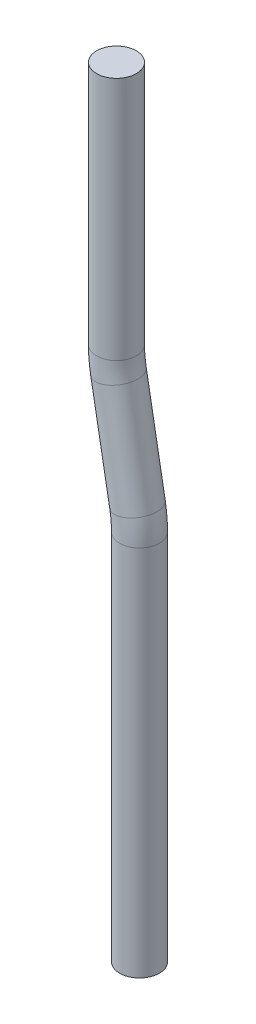
ISO-10303-21;
HEADER;
FILE_DESCRIPTION(('STEP AP214'),'2;1');
FILE_NAME('part.step','',(''),(''),'','','');
FILE_SCHEMA(('AUTOMOTIVE_DESIGN { 1 0 10303 214 1 1 1 1 }'));
ENDSEC;
DATA;
#1=APPLICATION_CONTEXT('core data for automotive mechanical design processes');
#2=APPLICATION_PROTOCOL_DEFINITION('international standard','automotive_design',2000,#1);
#3=PRODUCT_CONTEXT('',#1,'mechanical');
#4=PRODUCT('Part','Part','',(#3));
#5=PRODUCT_RELATED_PRODUCT_CATEGORY('part','',(#4));
#6=PRODUCT_DEFINITION_FORMATION('','',#4);
#7=PRODUCT_DEFINITION_CONTEXT('part definition',#1,'design');
#8=PRODUCT_DEFINITION('design','',#6,#7);
#9=PRODUCT_DEFINITION_SHAPE('','',#8);
#10=(LENGTH_UNIT() NAMED_UNIT(*) SI_UNIT(.MILLI.,.METRE.));
#11=(NAMED_UNIT(*) PLANE_ANGLE_UNIT() SI_UNIT($,.RADIAN.));
#12=(NAMED_UNIT(*) SI_UNIT($,.STERADIAN.) SOLID_ANGLE_UNIT());
#13=UNCERTAINTY_MEASURE_WITH_UNIT(LENGTH_MEASURE(1.E-05),#10,'distance_accuracy_value','');
#14=(GEOMETRIC_REPRESENTATION_CONTEXT(3) GLOBAL_UNCERTAINTY_ASSIGNED_CONTEXT((#13)) GLOBAL_UNIT_ASSIGNED_CONTEXT((#10,
#11,#12)) REPRESENTATION_CONTEXT('',''));
#15=CARTESIAN_POINT('',(0.,0.,0.));
#16=DIRECTION('',(0.,0.,1.));
#17=DIRECTION('',(1.,0.,0.));
#18=AXIS2_PLACEMENT_3D('',#15,#16,#17);
#19=CARTESIAN_POINT('',(0.,0.,0.));
#20=DIRECTION('',(0.,1.,0.));
#21=DIRECTION('',(0.,0.,1.));
#22=AXIS2_PLACEMENT_3D('',#19,#20,#21);
#23=PLANE('',#22);
#24=CARTESIAN_POINT('',(0.,0.,0.));
#25=DIRECTION('',(0.,1.,0.));
#26=DIRECTION('',(0.,0.,1.));
#27=AXIS2_PLACEMENT_3D('',#24,#25,#26);
#28=CIRCLE('',#27,3.937);
#29=CARTESIAN_POINT('',(0.,0.,3.937));
#30=VERTEX_POINT('',#29);
#31=EDGE_CURVE('E64',#30,#30,#28,.T.);
#32=ORIENTED_EDGE('',*,*,#31,.T.);
#33=EDGE_LOOP('',(#32));
#34=FACE_BOUND('',#33,.T.);
#35=ADVANCED_FACE('F37',(#34),#23,.T.);
#36=CARTESIAN_POINT('',(4.57200000000002,-152.4,0.));
#37=DIRECTION('',(0.,1.,0.));
#38=DIRECTION('',(0.,0.,1.));
#39=AXIS2_PLACEMENT_3D('',#36,#37,#38);
#40=PLANE('',#39);
#41=CARTESIAN_POINT('',(4.57200000000002,-152.4,0.));
#42=DIRECTION('',(0.,1.,0.));
#43=DIRECTION('',(0.,0.,1.));
#44=AXIS2_PLACEMENT_3D('',#41,#42,#43);
#45=CIRCLE('',#44,3.937);
#46=CARTESIAN_POINT('',(4.57200000000002,-152.4,3.937));
#47=VERTEX_POINT('',#46);
#48=EDGE_CURVE('E10',#47,#47,#45,.T.);
#49=ORIENTED_EDGE('',*,*,#48,.F.);
#50=EDGE_LOOP('',(#49));
#51=FACE_BOUND('',#50,.T.);
#52=ADVANCED_FACE('F73',(#51),#40,.F.);
#53=CARTESIAN_POINT('',(0.,0.,0.));
#54=DIRECTION('',(0.,-1.,0.));
#55=DIRECTION('',(1.,0.,0.));
#56=AXIS2_PLACEMENT_3D('',#53,#54,#55);
#57=CYLINDRICAL_SURFACE('',#56,3.937);
#58=CARTESIAN_POINT('',(0.,-48.5322225709485,0.));
#59=DIRECTION('',(0.,1.,0.));
#60=DIRECTION('',(0.,0.,1.));
#61=AXIS2_PLACEMENT_3D('',#58,#59,#60);
#62=CIRCLE('',#61,3.937);
#63=CARTESIAN_POINT('',(-3.937,-48.5322225709485,0.));
#64=VERTEX_POINT('',#63);
#65=EDGE_CURVE('E60',#64,#64,#62,.T.);
#66=ORIENTED_EDGE('',*,*,#65,.T.);
#67=EDGE_LOOP('',(#66));
#68=FACE_BOUND('',#67,.T.);
#69=ORIENTED_EDGE('',*,*,#31,.F.);
#70=EDGE_LOOP('',(#69));
#71=FACE_BOUND('',#70,.T.);
#72=ADVANCED_FACE('F70',(#68,#71),#57,.T.);
#73=CARTESIAN_POINT('',(25.4,-48.5322225709486,0.));
#74=DIRECTION('',(0.,0.,1.));
#75=DIRECTION('',(1.,0.,0.));
#76=AXIS2_PLACEMENT_3D('',#73,#74,#75);
#77=TOROIDAL_SURFACE('',#76,25.4,3.937);
#78=CARTESIAN_POINT('',(0.401743571068161,-53.0319087281564,0.));
#79=DIRECTION('',(-0.177152998315269,0.984183323973695,0.));
#80=DIRECTION('',(0.,0.,1.));
#81=AXIS2_PLACEMENT_3D('',#78,#79,#80);
#82=CIRCLE('',#81,3.937);
#83=CARTESIAN_POINT('',(-3.47298617541627,-53.7293600825236,0.));
#84=VERTEX_POINT('',#83);
#85=EDGE_CURVE('E54',#84,#84,#82,.T.);
#86=CARTESIAN_POINT('',(25.4,-48.5322225709486,0.));
#87=DIRECTION('',(0.,0.,1.));
#88=DIRECTION('',(1.,0.,0.));
#89=AXIS2_PLACEMENT_3D('',#86,#87,#88);
#90=CIRCLE('',#89,29.337);
#91=EDGE_CURVE('',#64,#84,#90,.T.);
#92=ORIENTED_EDGE('',*,*,#65,.F.);
#93=ORIENTED_EDGE('',*,*,#85,.T.);
#94=ORIENTED_EDGE('',*,*,#91,.T.);
#95=ORIENTED_EDGE('',*,*,#91,.F.);
#96=EDGE_LOOP('',(#92,#94,#93,#95));
#97=FACE_BOUND('',#96,.T.);
#98=ADVANCED_FACE('F72',(#97),#77,.T.);
#99=CARTESIAN_POINT('',(0.401743571068162,-53.0319087281564,0.));
#100=DIRECTION('',(0.177152998315265,-0.984183323973695,0.));
#101=DIRECTION('',(0.984183323973695,0.177152998315265,0.));
#102=AXIS2_PLACEMENT_3D('',#99,#100,#101);
#103=CYLINDRICAL_SURFACE('',#102,3.937);
#104=CARTESIAN_POINT('',(4.17025642893185,-73.9680912718436,0.));
#105=DIRECTION('',(-0.177152998315265,0.984183323973695,0.));
#106=DIRECTION('',(0.,0.,1.));
#107=AXIS2_PLACEMENT_3D('',#104,#105,#106);
#108=CIRCLE('',#107,3.937);
#109=CARTESIAN_POINT('',(8.04498617541629,-73.2706399174764,0.));
#110=VERTEX_POINT('',#109);
#111=EDGE_CURVE('E49',#110,#110,#108,.T.);
#112=ORIENTED_EDGE('',*,*,#111,.T.);
#113=EDGE_LOOP('',(#112));
#114=FACE_BOUND('',#113,.T.);
#115=ORIENTED_EDGE('',*,*,#85,.F.);
#116=EDGE_LOOP('',(#115));
#117=FACE_BOUND('',#116,.T.);
#118=ADVANCED_FACE('F80',(#114,#117),#103,.T.);
#119=CARTESIAN_POINT('',(-20.828,-78.4677774290514,0.));
#120=DIRECTION('',(0.,0.,-1.));
#121=DIRECTION('',(-1.,0.,0.));
#122=AXIS2_PLACEMENT_3D('',#119,#120,#121);
#123=TOROIDAL_SURFACE('',#122,25.4,3.937);
#124=CARTESIAN_POINT('',(4.57200000000001,-78.4677774290514,0.));
#125=DIRECTION('',(0.,1.,0.));
#126=DIRECTION('',(0.,0.,1.));
#127=AXIS2_PLACEMENT_3D('',#124,#125,#126);
#128=CIRCLE('',#127,3.937);
#129=CARTESIAN_POINT('',(8.50900000000001,-78.4677774290514,0.));
#130=VERTEX_POINT('',#129);
#131=EDGE_CURVE('E44',#130,#130,#128,.T.);
#132=CARTESIAN_POINT('',(-20.828,-78.4677774290514,0.));
#133=DIRECTION('',(0.,0.,-1.));
#134=DIRECTION('',(-1.,0.,0.));
#135=AXIS2_PLACEMENT_3D('',#132,#133,#134);
#136=CIRCLE('',#135,29.337);
#137=EDGE_CURVE('',#110,#130,#136,.T.);
#138=ORIENTED_EDGE('',*,*,#111,.F.);
#139=ORIENTED_EDGE('',*,*,#131,.T.);
#140=ORIENTED_EDGE('',*,*,#137,.T.);
#141=ORIENTED_EDGE('',*,*,#137,.F.);
#142=EDGE_LOOP('',(#138,#140,#139,#141));
#143=FACE_BOUND('',#142,.T.);
#144=ADVANCED_FACE('F86',(#143),#123,.T.);
#145=CARTESIAN_POINT('',(4.57200000000001,-78.4677774290515,0.));
#146=DIRECTION('',(0.,-1.,0.));
#147=DIRECTION('',(1.,0.,0.));
#148=AXIS2_PLACEMENT_3D('',#145,#146,#147);
#149=CYLINDRICAL_SURFACE('',#148,3.937);
#150=ORIENTED_EDGE('',*,*,#48,.T.);
#151=EDGE_LOOP('',(#150));
#152=FACE_BOUND('',#151,.T.);
#153=ORIENTED_EDGE('',*,*,#131,.F.);
#154=EDGE_LOOP('',(#153));
#155=FACE_BOUND('',#154,.T.);
#156=ADVANCED_FACE('F84',(#152,#155),#149,.T.);
#157=CLOSED_SHELL('',(#35,#52,#72,#98,#118,#144,#156));
#158=MANIFOLD_SOLID_BREP('B2',#157);
#159=ADVANCED_BREP_SHAPE_REPRESENTATION('',(#18,#158),#14);
#160=SHAPE_DEFINITION_REPRESENTATION(#9,#159);
ENDSEC;
END-ISO-10303-21;
